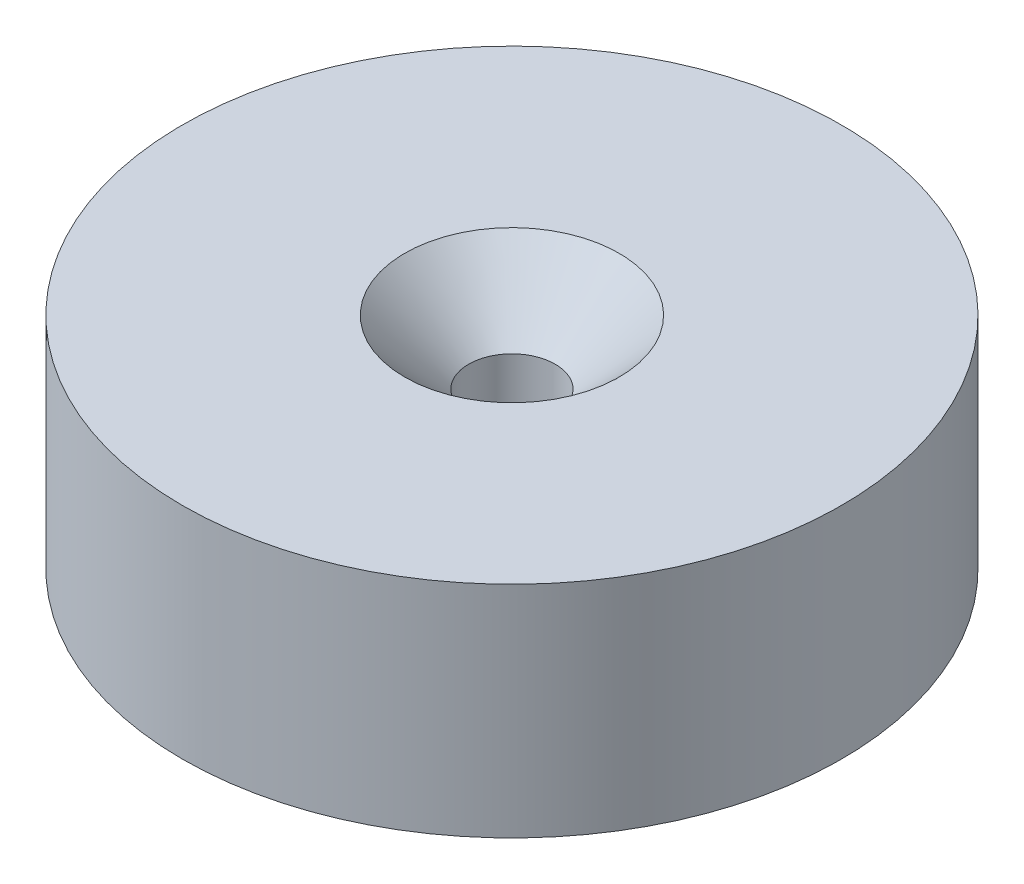
ISO-10303-21;
HEADER;
FILE_DESCRIPTION(('STEP AP214'),'2;1');
FILE_NAME('part.step','',(''),(''),'','','');
FILE_SCHEMA(('AUTOMOTIVE_DESIGN { 1 0 10303 214 1 1 1 1 }'));
ENDSEC;
DATA;
#1=APPLICATION_CONTEXT('core data for automotive mechanical design processes');
#2=APPLICATION_PROTOCOL_DEFINITION('international standard','automotive_design',2000,#1);
#3=PRODUCT_CONTEXT('',#1,'mechanical');
#4=PRODUCT('Part','Part','',(#3));
#5=PRODUCT_RELATED_PRODUCT_CATEGORY('part','',(#4));
#6=PRODUCT_DEFINITION_FORMATION('','',#4);
#7=PRODUCT_DEFINITION_CONTEXT('part definition',#1,'design');
#8=PRODUCT_DEFINITION('design','',#6,#7);
#9=PRODUCT_DEFINITION_SHAPE('','',#8);
#10=(LENGTH_UNIT() NAMED_UNIT(*) SI_UNIT(.MILLI.,.METRE.));
#11=(NAMED_UNIT(*) PLANE_ANGLE_UNIT() SI_UNIT($,.RADIAN.));
#12=(NAMED_UNIT(*) SI_UNIT($,.STERADIAN.) SOLID_ANGLE_UNIT());
#13=UNCERTAINTY_MEASURE_WITH_UNIT(LENGTH_MEASURE(1.E-05),#10,'distance_accuracy_value','');
#14=(GEOMETRIC_REPRESENTATION_CONTEXT(3) GLOBAL_UNCERTAINTY_ASSIGNED_CONTEXT((#13)) GLOBAL_UNIT_ASSIGNED_CONTEXT((#10,
#11,#12)) REPRESENTATION_CONTEXT('',''));
#15=CARTESIAN_POINT('',(0.,0.,0.));
#16=DIRECTION('',(0.,0.,1.));
#17=DIRECTION('',(1.,0.,0.));
#18=AXIS2_PLACEMENT_3D('',#15,#16,#17);
#19=CARTESIAN_POINT('',(0.,12.7,0.));
#20=DIRECTION('',(0.,-1.,0.));
#21=DIRECTION('',(0.,0.,-1.));
#22=AXIS2_PLACEMENT_3D('',#19,#20,#21);
#23=CYLINDRICAL_SURFACE('',#22,19.05);
#24=CARTESIAN_POINT('',(0.,12.7,0.));
#25=DIRECTION('',(0.,1.,0.));
#26=DIRECTION('',(0.,0.,1.));
#27=AXIS2_PLACEMENT_3D('',#24,#25,#26);
#28=CIRCLE('',#27,19.05);
#29=CARTESIAN_POINT('',(0.,12.7,19.05));
#30=VERTEX_POINT('',#29);
#31=EDGE_CURVE('E10',#30,#30,#28,.T.);
#32=ORIENTED_EDGE('',*,*,#31,.F.);
#33=EDGE_LOOP('',(#32));
#34=FACE_BOUND('',#33,.T.);
#35=CARTESIAN_POINT('',(0.,0.,0.));
#36=DIRECTION('',(0.,1.,0.));
#37=DIRECTION('',(0.,0.,1.));
#38=AXIS2_PLACEMENT_3D('',#35,#36,#37);
#39=CIRCLE('',#38,19.05);
#40=CARTESIAN_POINT('',(0.,0.,19.05));
#41=VERTEX_POINT('',#40);
#42=EDGE_CURVE('E46',#41,#41,#39,.T.);
#43=ORIENTED_EDGE('',*,*,#42,.T.);
#44=EDGE_LOOP('',(#43));
#45=FACE_BOUND('',#44,.T.);
#46=ADVANCED_FACE('F43',(#34,#45),#23,.T.);
#47=CARTESIAN_POINT('',(0.,12.7,0.));
#48=DIRECTION('',(0.,1.,0.));
#49=DIRECTION('',(0.,0.,1.));
#50=AXIS2_PLACEMENT_3D('',#47,#48,#49);
#51=PLANE('',#50);
#52=CARTESIAN_POINT('',(0.,12.7,0.));
#53=DIRECTION('',(0.,1.,0.));
#54=DIRECTION('',(0.,0.,1.));
#55=AXIS2_PLACEMENT_3D('',#52,#53,#54);
#56=CIRCLE('',#55,6.2);
#57=CARTESIAN_POINT('',(0.,12.7,6.2));
#58=VERTEX_POINT('',#57);
#59=EDGE_CURVE('E60',#58,#58,#56,.T.);
#60=ORIENTED_EDGE('',*,*,#59,.F.);
#61=EDGE_LOOP('',(#60));
#62=FACE_BOUND('',#61,.T.);
#63=ORIENTED_EDGE('',*,*,#31,.T.);
#64=EDGE_LOOP('',(#63));
#65=FACE_BOUND('',#64,.T.);
#66=ADVANCED_FACE('F66',(#62,#65),#51,.T.);
#67=CARTESIAN_POINT('',(0.,0.,0.));
#68=DIRECTION('',(0.,1.,0.));
#69=DIRECTION('',(0.,0.,1.));
#70=AXIS2_PLACEMENT_3D('',#67,#68,#69);
#71=PLANE('',#70);
#72=CARTESIAN_POINT('',(0.,0.,0.));
#73=DIRECTION('',(0.,1.,0.));
#74=DIRECTION('',(0.,0.,1.));
#75=AXIS2_PLACEMENT_3D('',#72,#73,#74);
#76=CIRCLE('',#75,2.49999999999999);
#77=CARTESIAN_POINT('',(0.,0.,2.49999999999999));
#78=VERTEX_POINT('',#77);
#79=EDGE_CURVE('E53',#78,#78,#76,.T.);
#80=ORIENTED_EDGE('',*,*,#79,.T.);
#81=EDGE_LOOP('',(#80));
#82=FACE_BOUND('',#81,.T.);
#83=ORIENTED_EDGE('',*,*,#42,.F.);
#84=EDGE_LOOP('',(#83));
#85=FACE_BOUND('',#84,.T.);
#86=ADVANCED_FACE('F68',(#82,#85),#71,.F.);
#87=CARTESIAN_POINT('',(0.,12.7,0.));
#88=DIRECTION('',(0.,1.,0.));
#89=DIRECTION('',(0.,0.,1.));
#90=AXIS2_PLACEMENT_3D('',#87,#88,#89);
#91=CYLINDRICAL_SURFACE('',#90,2.49999999999999);
#92=ORIENTED_EDGE('',*,*,#79,.F.);
#93=EDGE_LOOP('',(#92));
#94=FACE_BOUND('',#93,.T.);
#95=CARTESIAN_POINT('',(0.,9.,0.));
#96=DIRECTION('',(0.,1.,0.));
#97=DIRECTION('',(0.,0.,1.));
#98=AXIS2_PLACEMENT_3D('',#95,#96,#97);
#99=CIRCLE('',#98,2.5);
#100=CARTESIAN_POINT('',(0.,9.,2.5));
#101=VERTEX_POINT('',#100);
#102=EDGE_CURVE('E57',#101,#101,#99,.T.);
#103=ORIENTED_EDGE('',*,*,#102,.T.);
#104=EDGE_LOOP('',(#103));
#105=FACE_BOUND('',#104,.T.);
#106=ADVANCED_FACE('F74',(#94,#105),#91,.F.);
#107=CARTESIAN_POINT('',(0.,12.7,0.));
#108=DIRECTION('',(0.,1.,0.));
#109=DIRECTION('',(0.,0.,1.));
#110=AXIS2_PLACEMENT_3D('',#107,#108,#109);
#111=CONICAL_SURFACE('',#110,6.2,0.785398163397449);
#112=ORIENTED_EDGE('',*,*,#102,.F.);
#113=EDGE_LOOP('',(#112));
#114=FACE_BOUND('',#113,.T.);
#115=ORIENTED_EDGE('',*,*,#59,.T.);
#116=EDGE_LOOP('',(#115));
#117=FACE_BOUND('',#116,.T.);
#118=ADVANCED_FACE('F64',(#114,#117),#111,.F.);
#119=CLOSED_SHELL('',(#46,#66,#86,#106,#118));
#120=MANIFOLD_SOLID_BREP('B2',#119);
#121=ADVANCED_BREP_SHAPE_REPRESENTATION('',(#18,#120),#14);
#122=SHAPE_DEFINITION_REPRESENTATION(#9,#121);
ENDSEC;
END-ISO-10303-21;
